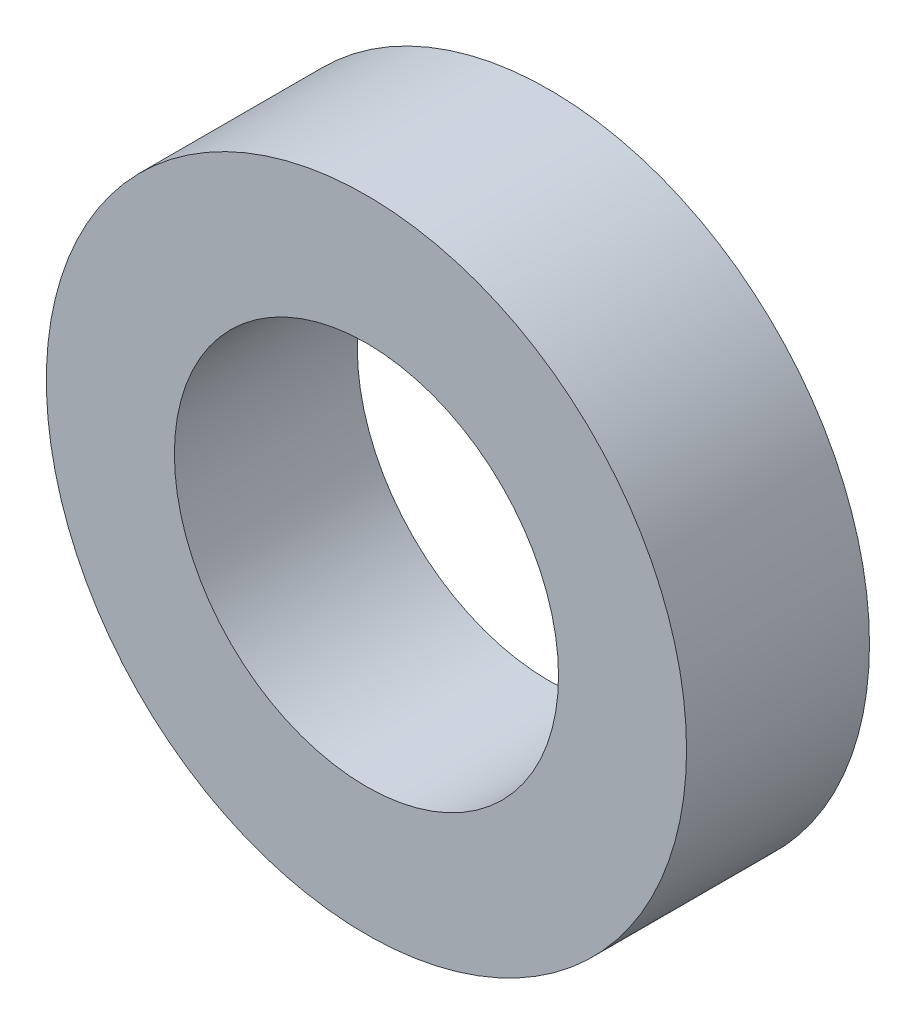
ISO-10303-21;
HEADER;
FILE_DESCRIPTION(('STEP AP214'),'2;1');
FILE_NAME('part.step','',(''),(''),'','','');
FILE_SCHEMA(('AUTOMOTIVE_DESIGN { 1 0 10303 214 1 1 1 1 }'));
ENDSEC;
DATA;
#1=APPLICATION_CONTEXT('core data for automotive mechanical design processes');
#2=APPLICATION_PROTOCOL_DEFINITION('international standard','automotive_design',2000,#1);
#3=PRODUCT_CONTEXT('',#1,'mechanical');
#4=PRODUCT('Part','Part','',(#3));
#5=PRODUCT_RELATED_PRODUCT_CATEGORY('part','',(#4));
#6=PRODUCT_DEFINITION_FORMATION('','',#4);
#7=PRODUCT_DEFINITION_CONTEXT('part definition',#1,'design');
#8=PRODUCT_DEFINITION('design','',#6,#7);
#9=PRODUCT_DEFINITION_SHAPE('','',#8);
#10=(LENGTH_UNIT() NAMED_UNIT(*) SI_UNIT(.MILLI.,.METRE.));
#11=(NAMED_UNIT(*) PLANE_ANGLE_UNIT() SI_UNIT($,.RADIAN.));
#12=(NAMED_UNIT(*) SI_UNIT($,.STERADIAN.) SOLID_ANGLE_UNIT());
#13=UNCERTAINTY_MEASURE_WITH_UNIT(LENGTH_MEASURE(1.E-05),#10,'distance_accuracy_value','');
#14=(GEOMETRIC_REPRESENTATION_CONTEXT(3) GLOBAL_UNCERTAINTY_ASSIGNED_CONTEXT((#13)) GLOBAL_UNIT_ASSIGNED_CONTEXT((#10,
#11,#12)) REPRESENTATION_CONTEXT('',''));
#15=CARTESIAN_POINT('',(0.,0.,0.));
#16=DIRECTION('',(0.,0.,1.));
#17=DIRECTION('',(1.,0.,0.));
#18=AXIS2_PLACEMENT_3D('',#15,#16,#17);
#19=CARTESIAN_POINT('',(0.,0.,2.));
#20=DIRECTION('',(0.,0.,1.));
#21=DIRECTION('',(1.,0.,0.));
#22=AXIS2_PLACEMENT_3D('',#19,#20,#21);
#23=PLANE('',#22);
#24=CARTESIAN_POINT('',(0.,0.,2.));
#25=DIRECTION('',(0.,0.,1.));
#26=DIRECTION('',(1.,0.,0.));
#27=AXIS2_PLACEMENT_3D('',#24,#25,#26);
#28=CIRCLE('',#27,3.5);
#29=CARTESIAN_POINT('',(3.5,0.,2.));
#30=VERTEX_POINT('',#29);
#31=EDGE_CURVE('E10',#30,#30,#28,.T.);
#32=ORIENTED_EDGE('',*,*,#31,.T.);
#33=EDGE_LOOP('',(#32));
#34=FACE_BOUND('',#33,.T.);
#35=CARTESIAN_POINT('',(0.,0.,2.));
#36=DIRECTION('',(0.,0.,1.));
#37=DIRECTION('',(1.,0.,0.));
#38=AXIS2_PLACEMENT_3D('',#35,#36,#37);
#39=CIRCLE('',#38,2.1);
#40=CARTESIAN_POINT('',(2.1,0.,2.));
#41=VERTEX_POINT('',#40);
#42=EDGE_CURVE('E50',#41,#41,#39,.T.);
#43=ORIENTED_EDGE('',*,*,#42,.F.);
#44=EDGE_LOOP('',(#43));
#45=FACE_BOUND('',#44,.T.);
#46=ADVANCED_FACE('F37',(#34,#45),#23,.T.);
#47=CARTESIAN_POINT('',(0.,0.,0.));
#48=DIRECTION('',(0.,0.,1.));
#49=DIRECTION('',(1.,0.,0.));
#50=AXIS2_PLACEMENT_3D('',#47,#48,#49);
#51=PLANE('',#50);
#52=CARTESIAN_POINT('',(0.,0.,0.));
#53=DIRECTION('',(0.,0.,1.));
#54=DIRECTION('',(1.,0.,0.));
#55=AXIS2_PLACEMENT_3D('',#52,#53,#54);
#56=CIRCLE('',#55,3.5);
#57=CARTESIAN_POINT('',(3.5,0.,0.));
#58=VERTEX_POINT('',#57);
#59=EDGE_CURVE('E41',#58,#58,#56,.T.);
#60=ORIENTED_EDGE('',*,*,#59,.F.);
#61=EDGE_LOOP('',(#60));
#62=FACE_BOUND('',#61,.T.);
#63=CARTESIAN_POINT('',(0.,0.,0.));
#64=DIRECTION('',(0.,0.,1.));
#65=DIRECTION('',(1.,0.,0.));
#66=AXIS2_PLACEMENT_3D('',#63,#64,#65);
#67=CIRCLE('',#66,2.1);
#68=CARTESIAN_POINT('',(2.1,0.,0.));
#69=VERTEX_POINT('',#68);
#70=EDGE_CURVE('E52',#69,#69,#67,.T.);
#71=ORIENTED_EDGE('',*,*,#70,.T.);
#72=EDGE_LOOP('',(#71));
#73=FACE_BOUND('',#72,.T.);
#74=ADVANCED_FACE('F64',(#62,#73),#51,.F.);
#75=CARTESIAN_POINT('',(0.,0.,2.));
#76=DIRECTION('',(0.,0.,-1.));
#77=DIRECTION('',(-1.,0.,0.));
#78=AXIS2_PLACEMENT_3D('',#75,#76,#77);
#79=CYLINDRICAL_SURFACE('',#78,3.5);
#80=ORIENTED_EDGE('',*,*,#31,.F.);
#81=EDGE_LOOP('',(#80));
#82=FACE_BOUND('',#81,.T.);
#83=ORIENTED_EDGE('',*,*,#59,.T.);
#84=EDGE_LOOP('',(#83));
#85=FACE_BOUND('',#84,.T.);
#86=ADVANCED_FACE('F39',(#82,#85),#79,.T.);
#87=CARTESIAN_POINT('',(0.,0.,2.));
#88=DIRECTION('',(0.,0.,-1.));
#89=DIRECTION('',(-1.,0.,0.));
#90=AXIS2_PLACEMENT_3D('',#87,#88,#89);
#91=CYLINDRICAL_SURFACE('',#90,2.1);
#92=ORIENTED_EDGE('',*,*,#42,.T.);
#93=EDGE_LOOP('',(#92));
#94=FACE_BOUND('',#93,.T.);
#95=ORIENTED_EDGE('',*,*,#70,.F.);
#96=EDGE_LOOP('',(#95));
#97=FACE_BOUND('',#96,.T.);
#98=ADVANCED_FACE('F60',(#94,#97),#91,.F.);
#99=CLOSED_SHELL('',(#46,#74,#86,#98));
#100=MANIFOLD_SOLID_BREP('B2',#99);
#101=ADVANCED_BREP_SHAPE_REPRESENTATION('',(#18,#100),#14);
#102=SHAPE_DEFINITION_REPRESENTATION(#9,#101);
ENDSEC;
END-ISO-10303-21;
